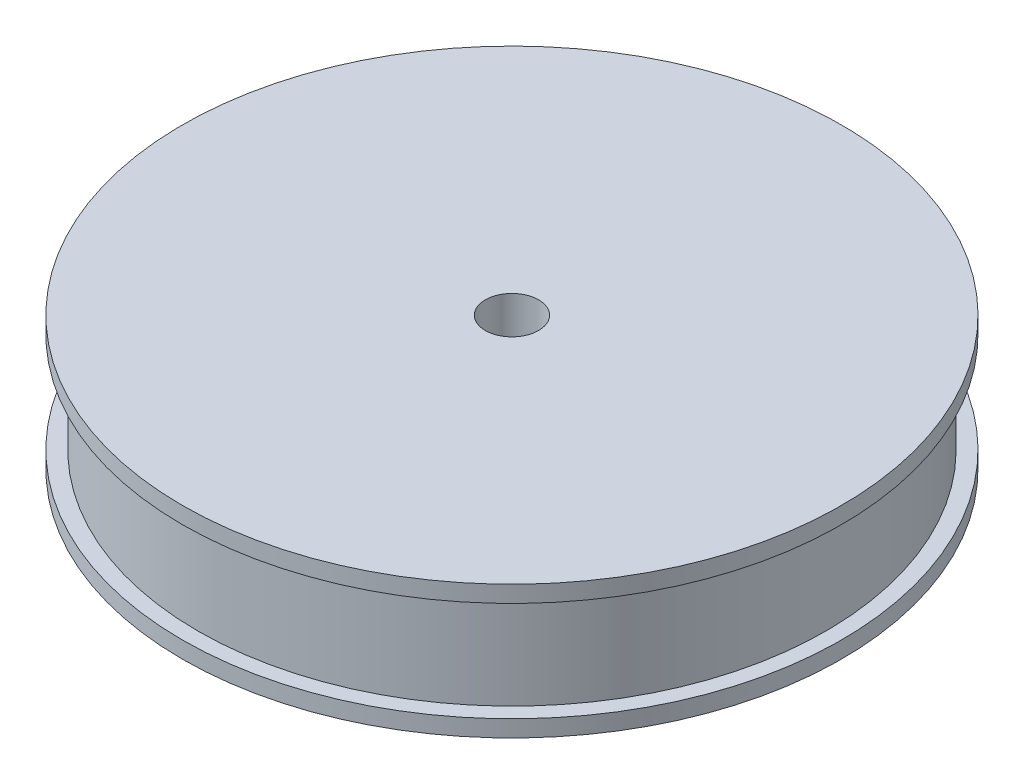
ISO-10303-21;
HEADER;
FILE_DESCRIPTION(('STEP AP214'),'2;1');
FILE_NAME('part.step','',(''),(''),'','','');
FILE_SCHEMA(('AUTOMOTIVE_DESIGN { 1 0 10303 214 1 1 1 1 }'));
ENDSEC;
DATA;
#1=APPLICATION_CONTEXT('core data for automotive mechanical design processes');
#2=APPLICATION_PROTOCOL_DEFINITION('international standard','automotive_design',2000,#1);
#3=PRODUCT_CONTEXT('',#1,'mechanical');
#4=PRODUCT('Part','Part','',(#3));
#5=PRODUCT_RELATED_PRODUCT_CATEGORY('part','',(#4));
#6=PRODUCT_DEFINITION_FORMATION('','',#4);
#7=PRODUCT_DEFINITION_CONTEXT('part definition',#1,'design');
#8=PRODUCT_DEFINITION('design','',#6,#7);
#9=PRODUCT_DEFINITION_SHAPE('','',#8);
#10=(LENGTH_UNIT() NAMED_UNIT(*) SI_UNIT(.MILLI.,.METRE.));
#11=(NAMED_UNIT(*) PLANE_ANGLE_UNIT() SI_UNIT($,.RADIAN.));
#12=(NAMED_UNIT(*) SI_UNIT($,.STERADIAN.) SOLID_ANGLE_UNIT());
#13=UNCERTAINTY_MEASURE_WITH_UNIT(LENGTH_MEASURE(1.E-05),#10,'distance_accuracy_value','');
#14=(GEOMETRIC_REPRESENTATION_CONTEXT(3) GLOBAL_UNCERTAINTY_ASSIGNED_CONTEXT((#13)) GLOBAL_UNIT_ASSIGNED_CONTEXT((#10,
#11,#12)) REPRESENTATION_CONTEXT('',''));
#15=CARTESIAN_POINT('',(0.,0.,0.));
#16=DIRECTION('',(0.,0.,1.));
#17=DIRECTION('',(1.,0.,0.));
#18=AXIS2_PLACEMENT_3D('',#15,#16,#17);
#19=CARTESIAN_POINT('',(0.,12.3387096774194,0.));
#20=DIRECTION('',(0.,1.,0.));
#21=DIRECTION('',(0.,0.,1.));
#22=AXIS2_PLACEMENT_3D('',#19,#20,#21);
#23=CYLINDRICAL_SURFACE('',#22,4.);
#24=CARTESIAN_POINT('',(0.,-7.66129032258065,0.));
#25=DIRECTION('',(0.,1.,0.));
#26=DIRECTION('',(0.,0.,1.));
#27=AXIS2_PLACEMENT_3D('',#24,#25,#26);
#28=CIRCLE('',#27,4.);
#29=CARTESIAN_POINT('',(0.,-7.66129032258065,4.));
#30=VERTEX_POINT('',#29);
#31=EDGE_CURVE('E10',#30,#30,#28,.T.);
#32=ORIENTED_EDGE('',*,*,#31,.F.);
#33=EDGE_LOOP('',(#32));
#34=FACE_BOUND('',#33,.T.);
#35=CARTESIAN_POINT('',(0.,12.3387096774194,0.));
#36=DIRECTION('',(0.,1.,0.));
#37=DIRECTION('',(0.,0.,1.));
#38=AXIS2_PLACEMENT_3D('',#35,#36,#37);
#39=CIRCLE('',#38,4.);
#40=CARTESIAN_POINT('',(0.,12.3387096774194,4.));
#41=VERTEX_POINT('',#40);
#42=EDGE_CURVE('E63',#41,#41,#39,.T.);
#43=ORIENTED_EDGE('',*,*,#42,.T.);
#44=EDGE_LOOP('',(#43));
#45=FACE_BOUND('',#44,.T.);
#46=ADVANCED_FACE('F35',(#34,#45),#23,.F.);
#47=CARTESIAN_POINT('',(4.,-7.66129032258065,0.));
#48=DIRECTION('',(0.,1.,0.));
#49=DIRECTION('',(0.,0.,1.));
#50=AXIS2_PLACEMENT_3D('',#47,#48,#49);
#51=PLANE('',#50);
#52=CARTESIAN_POINT('',(0.,-7.66129032258065,0.));
#53=DIRECTION('',(0.,1.,0.));
#54=DIRECTION('',(0.,0.,1.));
#55=AXIS2_PLACEMENT_3D('',#52,#53,#54);
#56=CIRCLE('',#55,49.5);
#57=CARTESIAN_POINT('',(0.,-7.66129032258065,49.5));
#58=VERTEX_POINT('',#57);
#59=EDGE_CURVE('E41',#58,#58,#56,.T.);
#60=ORIENTED_EDGE('',*,*,#59,.F.);
#61=EDGE_LOOP('',(#60));
#62=FACE_BOUND('',#61,.T.);
#63=ORIENTED_EDGE('',*,*,#31,.T.);
#64=EDGE_LOOP('',(#63));
#65=FACE_BOUND('',#64,.T.);
#66=ADVANCED_FACE('F100',(#62,#65),#51,.F.);
#67=CARTESIAN_POINT('',(0.,12.3387096774194,0.));
#68=DIRECTION('',(0.,1.,0.));
#69=DIRECTION('',(0.,0.,1.));
#70=AXIS2_PLACEMENT_3D('',#67,#68,#69);
#71=CYLINDRICAL_SURFACE('',#70,49.5);
#72=CARTESIAN_POINT('',(0.,-5.16129032258065,0.));
#73=DIRECTION('',(0.,1.,0.));
#74=DIRECTION('',(0.,0.,1.));
#75=AXIS2_PLACEMENT_3D('',#72,#73,#74);
#76=CIRCLE('',#75,49.5);
#77=CARTESIAN_POINT('',(0.,-5.16129032258065,49.5));
#78=VERTEX_POINT('',#77);
#79=EDGE_CURVE('E45',#78,#78,#76,.T.);
#80=ORIENTED_EDGE('',*,*,#79,.F.);
#81=EDGE_LOOP('',(#80));
#82=FACE_BOUND('',#81,.T.);
#83=ORIENTED_EDGE('',*,*,#59,.T.);
#84=EDGE_LOOP('',(#83));
#85=FACE_BOUND('',#84,.T.);
#86=ADVANCED_FACE('F95',(#82,#85),#71,.T.);
#87=CARTESIAN_POINT('',(49.5,-5.16129032258065,0.));
#88=DIRECTION('',(0.,-1.,0.));
#89=DIRECTION('',(0.,0.,-1.));
#90=AXIS2_PLACEMENT_3D('',#87,#88,#89);
#91=PLANE('',#90);
#92=CARTESIAN_POINT('',(0.,-5.16129032258065,0.));
#93=DIRECTION('',(0.,1.,0.));
#94=DIRECTION('',(0.,0.,1.));
#95=AXIS2_PLACEMENT_3D('',#92,#93,#94);
#96=CIRCLE('',#95,47.175);
#97=CARTESIAN_POINT('',(0.,-5.16129032258065,47.175));
#98=VERTEX_POINT('',#97);
#99=EDGE_CURVE('E49',#98,#98,#96,.T.);
#100=ORIENTED_EDGE('',*,*,#99,.F.);
#101=EDGE_LOOP('',(#100));
#102=FACE_BOUND('',#101,.T.);
#103=ORIENTED_EDGE('',*,*,#79,.T.);
#104=EDGE_LOOP('',(#103));
#105=FACE_BOUND('',#104,.T.);
#106=ADVANCED_FACE('F89',(#102,#105),#91,.F.);
#107=CARTESIAN_POINT('',(0.,12.3387096774194,0.));
#108=DIRECTION('',(0.,1.,0.));
#109=DIRECTION('',(0.,0.,1.));
#110=AXIS2_PLACEMENT_3D('',#107,#108,#109);
#111=CYLINDRICAL_SURFACE('',#110,47.175);
#112=CARTESIAN_POINT('',(0.,9.83870967741935,0.));
#113=DIRECTION('',(0.,1.,0.));
#114=DIRECTION('',(0.,0.,1.));
#115=AXIS2_PLACEMENT_3D('',#112,#113,#114);
#116=CIRCLE('',#115,47.175);
#117=CARTESIAN_POINT('',(0.,9.83870967741935,47.175));
#118=VERTEX_POINT('',#117);
#119=EDGE_CURVE('E54',#118,#118,#116,.T.);
#120=ORIENTED_EDGE('',*,*,#119,.F.);
#121=EDGE_LOOP('',(#120));
#122=FACE_BOUND('',#121,.T.);
#123=ORIENTED_EDGE('',*,*,#99,.T.);
#124=EDGE_LOOP('',(#123));
#125=FACE_BOUND('',#124,.T.);
#126=ADVANCED_FACE('F83',(#122,#125),#111,.T.);
#127=CARTESIAN_POINT('',(47.175,9.83870967741935,0.));
#128=DIRECTION('',(0.,1.,0.));
#129=DIRECTION('',(0.,0.,1.));
#130=AXIS2_PLACEMENT_3D('',#127,#128,#129);
#131=PLANE('',#130);
#132=CARTESIAN_POINT('',(0.,9.83870967741935,0.));
#133=DIRECTION('',(0.,1.,0.));
#134=DIRECTION('',(0.,0.,1.));
#135=AXIS2_PLACEMENT_3D('',#132,#133,#134);
#136=CIRCLE('',#135,49.5);
#137=CARTESIAN_POINT('',(0.,9.83870967741935,49.5));
#138=VERTEX_POINT('',#137);
#139=EDGE_CURVE('E57',#138,#138,#136,.T.);
#140=ORIENTED_EDGE('',*,*,#139,.F.);
#141=EDGE_LOOP('',(#140));
#142=FACE_BOUND('',#141,.T.);
#143=ORIENTED_EDGE('',*,*,#119,.T.);
#144=EDGE_LOOP('',(#143));
#145=FACE_BOUND('',#144,.T.);
#146=ADVANCED_FACE('F77',(#142,#145),#131,.F.);
#147=CARTESIAN_POINT('',(0.,12.3387096774194,0.));
#148=DIRECTION('',(0.,1.,0.));
#149=DIRECTION('',(0.,0.,1.));
#150=AXIS2_PLACEMENT_3D('',#147,#148,#149);
#151=CYLINDRICAL_SURFACE('',#150,49.5);
#152=CARTESIAN_POINT('',(0.,12.3387096774194,0.));
#153=DIRECTION('',(0.,1.,0.));
#154=DIRECTION('',(0.,0.,1.));
#155=AXIS2_PLACEMENT_3D('',#152,#153,#154);
#156=CIRCLE('',#155,49.5);
#157=CARTESIAN_POINT('',(0.,12.3387096774194,49.5));
#158=VERTEX_POINT('',#157);
#159=EDGE_CURVE('E60',#158,#158,#156,.T.);
#160=ORIENTED_EDGE('',*,*,#159,.F.);
#161=EDGE_LOOP('',(#160));
#162=FACE_BOUND('',#161,.T.);
#163=ORIENTED_EDGE('',*,*,#139,.T.);
#164=EDGE_LOOP('',(#163));
#165=FACE_BOUND('',#164,.T.);
#166=ADVANCED_FACE('F71',(#162,#165),#151,.T.);
#167=CARTESIAN_POINT('',(49.5,12.3387096774194,0.));
#168=DIRECTION('',(0.,-1.,0.));
#169=DIRECTION('',(0.,0.,-1.));
#170=AXIS2_PLACEMENT_3D('',#167,#168,#169);
#171=PLANE('',#170);
#172=ORIENTED_EDGE('',*,*,#42,.F.);
#173=EDGE_LOOP('',(#172));
#174=FACE_BOUND('',#173,.T.);
#175=ORIENTED_EDGE('',*,*,#159,.T.);
#176=EDGE_LOOP('',(#175));
#177=FACE_BOUND('',#176,.T.);
#178=ADVANCED_FACE('F68',(#174,#177),#171,.F.);
#179=CLOSED_SHELL('',(#46,#66,#86,#106,#126,#146,#166,#178));
#180=MANIFOLD_SOLID_BREP('B2',#179);
#181=ADVANCED_BREP_SHAPE_REPRESENTATION('',(#18,#180),#14);
#182=SHAPE_DEFINITION_REPRESENTATION(#9,#181);
ENDSEC;
END-ISO-10303-21;
